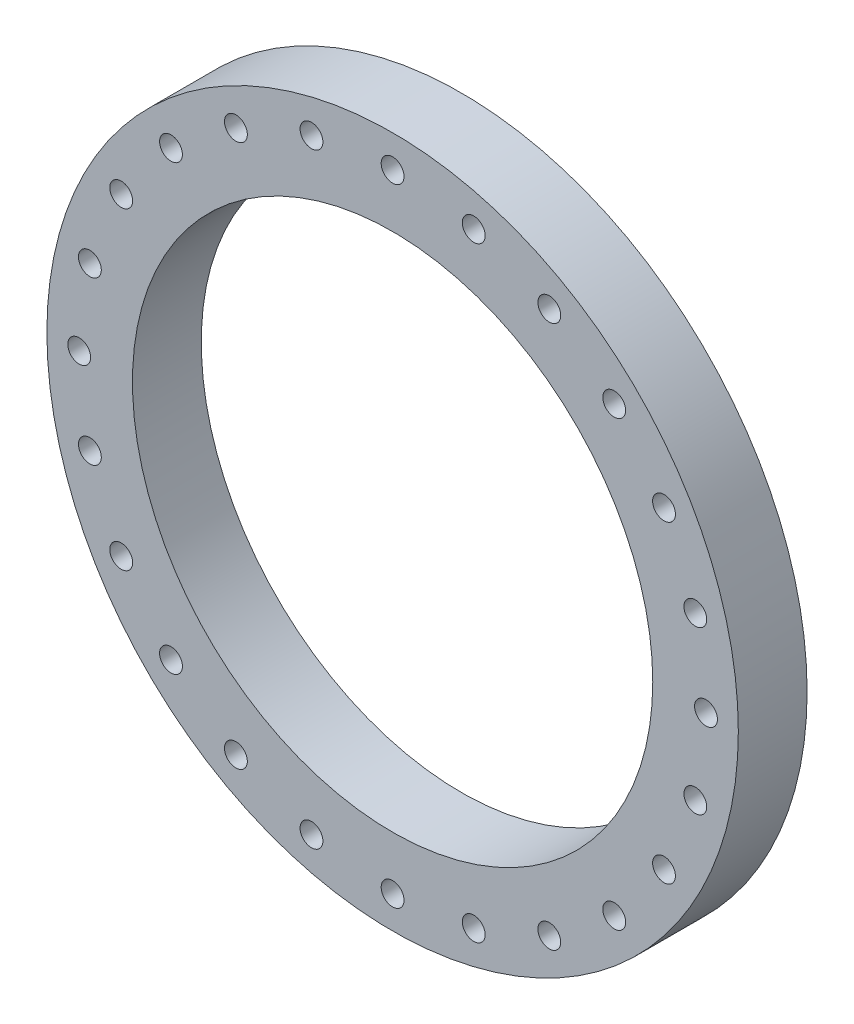
ISO-10303-21;
HEADER;
FILE_DESCRIPTION(('STEP AP214'),'2;1');
FILE_NAME('part.step','',(''),(''),'','','');
FILE_SCHEMA(('AUTOMOTIVE_DESIGN { 1 0 10303 214 1 1 1 1 }'));
ENDSEC;
DATA;
#1=APPLICATION_CONTEXT('core data for automotive mechanical design processes');
#2=APPLICATION_PROTOCOL_DEFINITION('international standard','automotive_design',2000,#1);
#3=PRODUCT_CONTEXT('',#1,'mechanical');
#4=PRODUCT('Part','Part','',(#3));
#5=PRODUCT_RELATED_PRODUCT_CATEGORY('part','',(#4));
#6=PRODUCT_DEFINITION_FORMATION('','',#4);
#7=PRODUCT_DEFINITION_CONTEXT('part definition',#1,'design');
#8=PRODUCT_DEFINITION('design','',#6,#7);
#9=PRODUCT_DEFINITION_SHAPE('','',#8);
#10=(LENGTH_UNIT() NAMED_UNIT(*) SI_UNIT(.MILLI.,.METRE.));
#11=(NAMED_UNIT(*) PLANE_ANGLE_UNIT() SI_UNIT($,.RADIAN.));
#12=(NAMED_UNIT(*) SI_UNIT($,.STERADIAN.) SOLID_ANGLE_UNIT());
#13=UNCERTAINTY_MEASURE_WITH_UNIT(LENGTH_MEASURE(1.E-05),#10,'distance_accuracy_value','');
#14=(GEOMETRIC_REPRESENTATION_CONTEXT(3) GLOBAL_UNCERTAINTY_ASSIGNED_CONTEXT((#13)) GLOBAL_UNIT_ASSIGNED_CONTEXT((#10,
#11,#12)) REPRESENTATION_CONTEXT('',''));
#15=CARTESIAN_POINT('',(0.,0.,0.));
#16=DIRECTION('',(0.,0.,1.));
#17=DIRECTION('',(1.,0.,0.));
#18=AXIS2_PLACEMENT_3D('',#15,#16,#17);
#19=CARTESIAN_POINT('',(0.,0.,12.7));
#20=DIRECTION('',(0.,0.,1.));
#21=DIRECTION('',(1.,0.,0.));
#22=AXIS2_PLACEMENT_3D('',#19,#20,#21);
#23=PLANE('',#22);
#24=CARTESIAN_POINT('',(-14.9755805324852,55.8896274200772,12.7));
#25=DIRECTION('',(0.,0.,1.));
#26=DIRECTION('',(1.,0.,0.));
#27=AXIS2_PLACEMENT_3D('',#24,#25,#26);
#28=CIRCLE('',#27,2.10819999999999);
#29=CARTESIAN_POINT('',(-12.8673805324852,55.8896274200772,12.7));
#30=VERTEX_POINT('',#29);
#31=EDGE_CURVE('E198',#30,#30,#28,.T.);
#32=ORIENTED_EDGE('',*,*,#31,.F.);
#33=EDGE_LOOP('',(#32));
#34=FACE_BOUND('',#33,.T.);
#35=CARTESIAN_POINT('',(-28.9305999999994,50.1092690934525,12.7));
#36=DIRECTION('',(0.,0.,1.));
#37=DIRECTION('',(1.,0.,0.));
#38=AXIS2_PLACEMENT_3D('',#35,#36,#37);
#39=CIRCLE('',#38,2.10819999999999);
#40=CARTESIAN_POINT('',(-26.8223999999994,50.1092690934525,12.7));
#41=VERTEX_POINT('',#40);
#42=EDGE_CURVE('E192',#41,#41,#39,.T.);
#43=ORIENTED_EDGE('',*,*,#42,.F.);
#44=EDGE_LOOP('',(#43));
#45=FACE_BOUND('',#44,.T.);
#46=CARTESIAN_POINT('',(-40.9140468875906,40.9140468875916,12.7));
#47=DIRECTION('',(0.,0.,1.));
#48=DIRECTION('',(1.,0.,0.));
#49=AXIS2_PLACEMENT_3D('',#46,#47,#48);
#50=CIRCLE('',#49,2.10819999999998);
#51=CARTESIAN_POINT('',(-38.8058468875906,40.9140468875916,12.7));
#52=VERTEX_POINT('',#51);
#53=EDGE_CURVE('E186',#52,#52,#50,.T.);
#54=ORIENTED_EDGE('',*,*,#53,.F.);
#55=EDGE_LOOP('',(#54));
#56=FACE_BOUND('',#55,.T.);
#57=CARTESIAN_POINT('',(-50.1092690934518,28.9306000000006,12.7));
#58=DIRECTION('',(0.,0.,1.));
#59=DIRECTION('',(1.,0.,0.));
#60=AXIS2_PLACEMENT_3D('',#57,#58,#59);
#61=CIRCLE('',#60,2.10819999999999);
#62=CARTESIAN_POINT('',(-48.0010690934518,28.9306000000006,12.7));
#63=VERTEX_POINT('',#62);
#64=EDGE_CURVE('E180',#63,#63,#61,.T.);
#65=ORIENTED_EDGE('',*,*,#64,.F.);
#66=EDGE_LOOP('',(#65));
#67=FACE_BOUND('',#66,.T.);
#68=CARTESIAN_POINT('',(-55.8896274200769,14.9755805324866,12.7));
#69=DIRECTION('',(0.,0.,1.));
#70=DIRECTION('',(1.,0.,0.));
#71=AXIS2_PLACEMENT_3D('',#68,#69,#70);
#72=CIRCLE('',#71,2.10819999999999);
#73=CARTESIAN_POINT('',(-53.7814274200769,14.9755805324866,12.7));
#74=VERTEX_POINT('',#73);
#75=EDGE_CURVE('E174',#74,#74,#72,.T.);
#76=ORIENTED_EDGE('',*,*,#75,.F.);
#77=EDGE_LOOP('',(#76));
#78=FACE_BOUND('',#77,.T.);
#79=CARTESIAN_POINT('',(-57.8612,6.06064251161466E-13,12.7));
#80=DIRECTION('',(0.,0.,1.));
#81=DIRECTION('',(1.,0.,0.));
#82=AXIS2_PLACEMENT_3D('',#79,#80,#81);
#83=CIRCLE('',#82,2.10819999999999);
#84=CARTESIAN_POINT('',(-55.753,6.06064251161466E-13,12.7));
#85=VERTEX_POINT('',#84);
#86=EDGE_CURVE('E168',#85,#85,#83,.T.);
#87=ORIENTED_EDGE('',*,*,#86,.F.);
#88=EDGE_LOOP('',(#87));
#89=FACE_BOUND('',#88,.T.);
#90=CARTESIAN_POINT('',(-55.8896274200772,-14.9755805324854,12.7));
#91=DIRECTION('',(0.,0.,1.));
#92=DIRECTION('',(1.,0.,0.));
#93=AXIS2_PLACEMENT_3D('',#90,#91,#92);
#94=CIRCLE('',#93,2.10819999999999);
#95=CARTESIAN_POINT('',(-53.7814274200772,-14.9755805324854,12.7));
#96=VERTEX_POINT('',#95);
#97=EDGE_CURVE('E162',#96,#96,#94,.T.);
#98=ORIENTED_EDGE('',*,*,#97,.F.);
#99=EDGE_LOOP('',(#98));
#100=FACE_BOUND('',#99,.T.);
#101=CARTESIAN_POINT('',(-50.1092690934524,-28.9305999999995,12.7));
#102=DIRECTION('',(0.,0.,1.));
#103=DIRECTION('',(1.,0.,0.));
#104=AXIS2_PLACEMENT_3D('',#101,#102,#103);
#105=CIRCLE('',#104,2.10819999999998);
#106=CARTESIAN_POINT('',(-48.0010690934524,-28.9305999999995,12.7));
#107=VERTEX_POINT('',#106);
#108=EDGE_CURVE('E156',#107,#107,#105,.T.);
#109=ORIENTED_EDGE('',*,*,#108,.F.);
#110=EDGE_LOOP('',(#109));
#111=FACE_BOUND('',#110,.T.);
#112=CARTESIAN_POINT('',(-40.9140468875914,-40.9140468875907,12.7));
#113=DIRECTION('',(0.,0.,1.));
#114=DIRECTION('',(1.,0.,0.));
#115=AXIS2_PLACEMENT_3D('',#112,#113,#114);
#116=CIRCLE('',#115,2.10819999999999);
#117=CARTESIAN_POINT('',(-38.8058468875914,-40.9140468875907,12.7));
#118=VERTEX_POINT('',#117);
#119=EDGE_CURVE('E150',#118,#118,#116,.T.);
#120=ORIENTED_EDGE('',*,*,#119,.F.);
#121=EDGE_LOOP('',(#120));
#122=FACE_BOUND('',#121,.T.);
#123=CARTESIAN_POINT('',(-28.9306000000004,-50.1092690934519,12.7));
#124=DIRECTION('',(0.,0.,1.));
#125=DIRECTION('',(1.,0.,0.));
#126=AXIS2_PLACEMENT_3D('',#123,#124,#125);
#127=CIRCLE('',#126,2.10819999999999);
#128=CARTESIAN_POINT('',(-26.8224000000004,-50.1092690934519,12.7));
#129=VERTEX_POINT('',#128);
#130=EDGE_CURVE('E144',#129,#129,#127,.T.);
#131=ORIENTED_EDGE('',*,*,#130,.F.);
#132=EDGE_LOOP('',(#131));
#133=FACE_BOUND('',#132,.T.);
#134=CARTESIAN_POINT('',(-14.9755805324864,-55.8896274200769,12.7));
#135=DIRECTION('',(0.,0.,1.));
#136=DIRECTION('',(1.,0.,0.));
#137=AXIS2_PLACEMENT_3D('',#134,#135,#136);
#138=CIRCLE('',#137,2.10819999999999);
#139=CARTESIAN_POINT('',(-12.8673805324864,-55.8896274200769,12.7));
#140=VERTEX_POINT('',#139);
#141=EDGE_CURVE('E138',#140,#140,#138,.T.);
#142=ORIENTED_EDGE('',*,*,#141,.F.);
#143=EDGE_LOOP('',(#142));
#144=FACE_BOUND('',#143,.T.);
#145=CARTESIAN_POINT('',(-4.04042834107644E-13,-57.8612,12.7));
#146=DIRECTION('',(0.,0.,1.));
#147=DIRECTION('',(1.,0.,0.));
#148=AXIS2_PLACEMENT_3D('',#145,#146,#147);
#149=CIRCLE('',#148,2.10819999999999);
#150=CARTESIAN_POINT('',(2.10819999999958,-57.8612,12.7));
#151=VERTEX_POINT('',#150);
#152=EDGE_CURVE('E132',#151,#151,#149,.T.);
#153=ORIENTED_EDGE('',*,*,#152,.F.);
#154=EDGE_LOOP('',(#153));
#155=FACE_BOUND('',#154,.T.);
#156=CARTESIAN_POINT('',(14.9755805324856,-55.8896274200771,12.7));
#157=DIRECTION('',(0.,0.,1.));
#158=DIRECTION('',(1.,0.,0.));
#159=AXIS2_PLACEMENT_3D('',#156,#157,#158);
#160=CIRCLE('',#159,2.10819999999999);
#161=CARTESIAN_POINT('',(17.0837805324856,-55.8896274200771,12.7));
#162=VERTEX_POINT('',#161);
#163=EDGE_CURVE('E126',#162,#162,#160,.T.);
#164=ORIENTED_EDGE('',*,*,#163,.F.);
#165=EDGE_LOOP('',(#164));
#166=FACE_BOUND('',#165,.T.);
#167=CARTESIAN_POINT('',(28.9305999999997,-50.1092690934523,12.7));
#168=DIRECTION('',(0.,0.,1.));
#169=DIRECTION('',(1.,0.,0.));
#170=AXIS2_PLACEMENT_3D('',#167,#168,#169);
#171=CIRCLE('',#170,2.10819999999999);
#172=CARTESIAN_POINT('',(31.0387999999997,-50.1092690934523,12.7));
#173=VERTEX_POINT('',#172);
#174=EDGE_CURVE('E120',#173,#173,#171,.T.);
#175=ORIENTED_EDGE('',*,*,#174,.F.);
#176=EDGE_LOOP('',(#175));
#177=FACE_BOUND('',#176,.T.);
#178=CARTESIAN_POINT('',(40.9140468875908,-40.9140468875913,12.7));
#179=DIRECTION('',(0.,0.,1.));
#180=DIRECTION('',(1.,0.,0.));
#181=AXIS2_PLACEMENT_3D('',#178,#179,#180);
#182=CIRCLE('',#181,2.10819999999998);
#183=CARTESIAN_POINT('',(43.0222468875908,-40.9140468875913,12.7));
#184=VERTEX_POINT('',#183);
#185=EDGE_CURVE('E114',#184,#184,#182,.T.);
#186=ORIENTED_EDGE('',*,*,#185,.F.);
#187=EDGE_LOOP('',(#186));
#188=FACE_BOUND('',#187,.T.);
#189=CARTESIAN_POINT('',(50.109269093452,-28.9306000000002,12.7));
#190=DIRECTION('',(0.,0.,1.));
#191=DIRECTION('',(1.,0.,0.));
#192=AXIS2_PLACEMENT_3D('',#189,#190,#191);
#193=CIRCLE('',#192,2.10819999999998);
#194=CARTESIAN_POINT('',(52.217469093452,-28.9306000000002,12.7));
#195=VERTEX_POINT('',#194);
#196=EDGE_CURVE('E108',#195,#195,#193,.T.);
#197=ORIENTED_EDGE('',*,*,#196,.F.);
#198=EDGE_LOOP('',(#197));
#199=FACE_BOUND('',#198,.T.);
#200=CARTESIAN_POINT('',(55.889627420077,-14.9755805324862,12.7));
#201=DIRECTION('',(0.,0.,1.));
#202=DIRECTION('',(1.,0.,0.));
#203=AXIS2_PLACEMENT_3D('',#200,#201,#202);
#204=CIRCLE('',#203,2.10819999999998);
#205=CARTESIAN_POINT('',(57.997827420077,-14.9755805324862,12.7));
#206=VERTEX_POINT('',#205);
#207=EDGE_CURVE('E102',#206,#206,#204,.T.);
#208=ORIENTED_EDGE('',*,*,#207,.F.);
#209=EDGE_LOOP('',(#208));
#210=FACE_BOUND('',#209,.T.);
#211=CARTESIAN_POINT('',(57.8612,-2.02021417053822E-13,12.7));
#212=DIRECTION('',(0.,0.,1.));
#213=DIRECTION('',(1.,0.,0.));
#214=AXIS2_PLACEMENT_3D('',#211,#212,#213);
#215=CIRCLE('',#214,2.10819999999999);
#216=CARTESIAN_POINT('',(59.9694,-2.02021417053822E-13,12.7));
#217=VERTEX_POINT('',#216);
#218=EDGE_CURVE('E96',#217,#217,#215,.T.);
#219=ORIENTED_EDGE('',*,*,#218,.F.);
#220=EDGE_LOOP('',(#219));
#221=FACE_BOUND('',#220,.T.);
#222=CARTESIAN_POINT('',(55.8896274200771,14.9755805324858,12.7));
#223=DIRECTION('',(0.,0.,1.));
#224=DIRECTION('',(1.,0.,0.));
#225=AXIS2_PLACEMENT_3D('',#222,#223,#224);
#226=CIRCLE('',#225,2.10819999999998);
#227=CARTESIAN_POINT('',(57.9978274200771,14.9755805324858,12.7));
#228=VERTEX_POINT('',#227);
#229=EDGE_CURVE('E90',#228,#228,#226,.T.);
#230=ORIENTED_EDGE('',*,*,#229,.F.);
#231=EDGE_LOOP('',(#230));
#232=FACE_BOUND('',#231,.T.);
#233=CARTESIAN_POINT('',(50.1092690934522,28.9305999999999,12.7));
#234=DIRECTION('',(0.,0.,1.));
#235=DIRECTION('',(1.,0.,0.));
#236=AXIS2_PLACEMENT_3D('',#233,#234,#235);
#237=CIRCLE('',#236,2.10819999999999);
#238=CARTESIAN_POINT('',(52.2174690934522,28.9305999999999,12.7));
#239=VERTEX_POINT('',#238);
#240=EDGE_CURVE('E84',#239,#239,#237,.T.);
#241=ORIENTED_EDGE('',*,*,#240,.F.);
#242=EDGE_LOOP('',(#241));
#243=FACE_BOUND('',#242,.T.);
#244=CARTESIAN_POINT('',(40.9140468875911,40.914046887591,12.7));
#245=DIRECTION('',(0.,0.,1.));
#246=DIRECTION('',(1.,0.,0.));
#247=AXIS2_PLACEMENT_3D('',#244,#245,#246);
#248=CIRCLE('',#247,2.10819999999998);
#249=CARTESIAN_POINT('',(43.0222468875911,40.914046887591,12.7));
#250=VERTEX_POINT('',#249);
#251=EDGE_CURVE('E78',#250,#250,#248,.T.);
#252=ORIENTED_EDGE('',*,*,#251,.F.);
#253=EDGE_LOOP('',(#252));
#254=FACE_BOUND('',#253,.T.);
#255=CARTESIAN_POINT('',(28.9306000000001,50.1092690934521,12.7));
#256=DIRECTION('',(0.,0.,1.));
#257=DIRECTION('',(1.,0.,0.));
#258=AXIS2_PLACEMENT_3D('',#255,#256,#257);
#259=CIRCLE('',#258,2.10819999999999);
#260=CARTESIAN_POINT('',(31.0388,50.1092690934521,12.7));
#261=VERTEX_POINT('',#260);
#262=EDGE_CURVE('E72',#261,#261,#259,.T.);
#263=ORIENTED_EDGE('',*,*,#262,.F.);
#264=EDGE_LOOP('',(#263));
#265=FACE_BOUND('',#264,.T.);
#266=CARTESIAN_POINT('',(14.975580532486,55.889627420077,12.7));
#267=DIRECTION('',(0.,0.,1.));
#268=DIRECTION('',(1.,0.,0.));
#269=AXIS2_PLACEMENT_3D('',#266,#267,#268);
#270=CIRCLE('',#269,2.10819999999999);
#271=CARTESIAN_POINT('',(17.083780532486,55.889627420077,12.7));
#272=VERTEX_POINT('',#271);
#273=EDGE_CURVE('E66',#272,#272,#270,.T.);
#274=ORIENTED_EDGE('',*,*,#273,.F.);
#275=EDGE_LOOP('',(#274));
#276=FACE_BOUND('',#275,.T.);
#277=CARTESIAN_POINT('',(0.,57.8612,12.7));
#278=DIRECTION('',(0.,0.,1.));
#279=DIRECTION('',(1.,0.,0.));
#280=AXIS2_PLACEMENT_3D('',#277,#278,#279);
#281=CIRCLE('',#280,2.10819999999999);
#282=CARTESIAN_POINT('',(2.10819999999999,57.8612,12.7));
#283=VERTEX_POINT('',#282);
#284=EDGE_CURVE('E60',#283,#283,#281,.T.);
#285=ORIENTED_EDGE('',*,*,#284,.F.);
#286=EDGE_LOOP('',(#285));
#287=FACE_BOUND('',#286,.T.);
#288=CARTESIAN_POINT('',(0.,0.,12.7));
#289=DIRECTION('',(0.,0.,1.));
#290=DIRECTION('',(1.,0.,0.));
#291=AXIS2_PLACEMENT_3D('',#288,#289,#290);
#292=CIRCLE('',#291,63.8302);
#293=CARTESIAN_POINT('',(63.8302,0.,12.7));
#294=VERTEX_POINT('',#293);
#295=EDGE_CURVE('E10',#294,#294,#292,.T.);
#296=ORIENTED_EDGE('',*,*,#295,.T.);
#297=EDGE_LOOP('',(#296));
#298=FACE_BOUND('',#297,.T.);
#299=CARTESIAN_POINT('',(0.,0.,12.7));
#300=DIRECTION('',(0.,0.,1.));
#301=DIRECTION('',(1.,0.,0.));
#302=AXIS2_PLACEMENT_3D('',#299,#300,#301);
#303=CIRCLE('',#302,48.0314);
#304=CARTESIAN_POINT('',(48.0314,0.,12.7));
#305=VERTEX_POINT('',#304);
#306=EDGE_CURVE('E50',#305,#305,#303,.T.);
#307=ORIENTED_EDGE('',*,*,#306,.F.);
#308=EDGE_LOOP('',(#307));
#309=FACE_BOUND('',#308,.T.);
#310=ADVANCED_FACE('F39',(#34,#45,#56,#67,#78,#89,#100,#111,#122,#133,#144,#155,#166,#177,#188,
#199,#210,#221,#232,#243,#254,#265,#276,#287,#298,#309),#23,.T.);
#311=CARTESIAN_POINT('',(0.,0.,0.));
#312=DIRECTION('',(0.,0.,1.));
#313=DIRECTION('',(1.,0.,0.));
#314=AXIS2_PLACEMENT_3D('',#311,#312,#313);
#315=PLANE('',#314);
#316=CARTESIAN_POINT('',(-14.9755805324852,55.8896274200772,0.));
#317=DIRECTION('',(0.,0.,1.));
#318=DIRECTION('',(1.,0.,0.));
#319=AXIS2_PLACEMENT_3D('',#316,#317,#318);
#320=CIRCLE('',#319,2.10819999999999);
#321=CARTESIAN_POINT('',(-12.8673805324852,55.8896274200772,0.));
#322=VERTEX_POINT('',#321);
#323=EDGE_CURVE('E195',#322,#322,#320,.T.);
#324=ORIENTED_EDGE('',*,*,#323,.T.);
#325=EDGE_LOOP('',(#324));
#326=FACE_BOUND('',#325,.T.);
#327=CARTESIAN_POINT('',(-28.9305999999994,50.1092690934525,0.));
#328=DIRECTION('',(0.,0.,1.));
#329=DIRECTION('',(1.,0.,0.));
#330=AXIS2_PLACEMENT_3D('',#327,#328,#329);
#331=CIRCLE('',#330,2.10819999999999);
#332=CARTESIAN_POINT('',(-26.8223999999994,50.1092690934525,0.));
#333=VERTEX_POINT('',#332);
#334=EDGE_CURVE('E189',#333,#333,#331,.T.);
#335=ORIENTED_EDGE('',*,*,#334,.T.);
#336=EDGE_LOOP('',(#335));
#337=FACE_BOUND('',#336,.T.);
#338=CARTESIAN_POINT('',(-40.9140468875906,40.9140468875916,0.));
#339=DIRECTION('',(0.,0.,1.));
#340=DIRECTION('',(1.,0.,0.));
#341=AXIS2_PLACEMENT_3D('',#338,#339,#340);
#342=CIRCLE('',#341,2.10819999999998);
#343=CARTESIAN_POINT('',(-38.8058468875906,40.9140468875916,0.));
#344=VERTEX_POINT('',#343);
#345=EDGE_CURVE('E183',#344,#344,#342,.T.);
#346=ORIENTED_EDGE('',*,*,#345,.T.);
#347=EDGE_LOOP('',(#346));
#348=FACE_BOUND('',#347,.T.);
#349=CARTESIAN_POINT('',(-50.1092690934518,28.9306000000006,0.));
#350=DIRECTION('',(0.,0.,1.));
#351=DIRECTION('',(1.,0.,0.));
#352=AXIS2_PLACEMENT_3D('',#349,#350,#351);
#353=CIRCLE('',#352,2.10819999999998);
#354=CARTESIAN_POINT('',(-48.0010690934518,28.9306000000006,0.));
#355=VERTEX_POINT('',#354);
#356=EDGE_CURVE('E177',#355,#355,#353,.T.);
#357=ORIENTED_EDGE('',*,*,#356,.T.);
#358=EDGE_LOOP('',(#357));
#359=FACE_BOUND('',#358,.T.);
#360=CARTESIAN_POINT('',(-55.8896274200769,14.9755805324866,0.));
#361=DIRECTION('',(0.,0.,1.));
#362=DIRECTION('',(1.,0.,0.));
#363=AXIS2_PLACEMENT_3D('',#360,#361,#362);
#364=CIRCLE('',#363,2.10819999999998);
#365=CARTESIAN_POINT('',(-53.7814274200769,14.9755805324866,0.));
#366=VERTEX_POINT('',#365);
#367=EDGE_CURVE('E171',#366,#366,#364,.T.);
#368=ORIENTED_EDGE('',*,*,#367,.T.);
#369=EDGE_LOOP('',(#368));
#370=FACE_BOUND('',#369,.T.);
#371=CARTESIAN_POINT('',(-57.8612,6.06064251161466E-13,0.));
#372=DIRECTION('',(0.,0.,1.));
#373=DIRECTION('',(1.,0.,0.));
#374=AXIS2_PLACEMENT_3D('',#371,#372,#373);
#375=CIRCLE('',#374,2.10819999999998);
#376=CARTESIAN_POINT('',(-55.753,6.06064251161466E-13,0.));
#377=VERTEX_POINT('',#376);
#378=EDGE_CURVE('E165',#377,#377,#375,.T.);
#379=ORIENTED_EDGE('',*,*,#378,.T.);
#380=EDGE_LOOP('',(#379));
#381=FACE_BOUND('',#380,.T.);
#382=CARTESIAN_POINT('',(-55.8896274200772,-14.9755805324854,0.));
#383=DIRECTION('',(0.,0.,1.));
#384=DIRECTION('',(1.,0.,0.));
#385=AXIS2_PLACEMENT_3D('',#382,#383,#384);
#386=CIRCLE('',#385,2.10819999999998);
#387=CARTESIAN_POINT('',(-53.7814274200772,-14.9755805324854,0.));
#388=VERTEX_POINT('',#387);
#389=EDGE_CURVE('E159',#388,#388,#386,.T.);
#390=ORIENTED_EDGE('',*,*,#389,.T.);
#391=EDGE_LOOP('',(#390));
#392=FACE_BOUND('',#391,.T.);
#393=CARTESIAN_POINT('',(-50.1092690934524,-28.9305999999995,0.));
#394=DIRECTION('',(0.,0.,1.));
#395=DIRECTION('',(1.,0.,0.));
#396=AXIS2_PLACEMENT_3D('',#393,#394,#395);
#397=CIRCLE('',#396,2.10819999999998);
#398=CARTESIAN_POINT('',(-48.0010690934524,-28.9305999999995,0.));
#399=VERTEX_POINT('',#398);
#400=EDGE_CURVE('E153',#399,#399,#397,.T.);
#401=ORIENTED_EDGE('',*,*,#400,.T.);
#402=EDGE_LOOP('',(#401));
#403=FACE_BOUND('',#402,.T.);
#404=CARTESIAN_POINT('',(-40.9140468875914,-40.9140468875907,0.));
#405=DIRECTION('',(0.,0.,1.));
#406=DIRECTION('',(1.,0.,0.));
#407=AXIS2_PLACEMENT_3D('',#404,#405,#406);
#408=CIRCLE('',#407,2.10819999999998);
#409=CARTESIAN_POINT('',(-38.8058468875914,-40.9140468875907,0.));
#410=VERTEX_POINT('',#409);
#411=EDGE_CURVE('E147',#410,#410,#408,.T.);
#412=ORIENTED_EDGE('',*,*,#411,.T.);
#413=EDGE_LOOP('',(#412));
#414=FACE_BOUND('',#413,.T.);
#415=CARTESIAN_POINT('',(-28.9306000000004,-50.1092690934519,0.));
#416=DIRECTION('',(0.,0.,1.));
#417=DIRECTION('',(1.,0.,0.));
#418=AXIS2_PLACEMENT_3D('',#415,#416,#417);
#419=CIRCLE('',#418,2.10819999999999);
#420=CARTESIAN_POINT('',(-26.8224000000004,-50.1092690934519,0.));
#421=VERTEX_POINT('',#420);
#422=EDGE_CURVE('E141',#421,#421,#419,.T.);
#423=ORIENTED_EDGE('',*,*,#422,.T.);
#424=EDGE_LOOP('',(#423));
#425=FACE_BOUND('',#424,.T.);
#426=CARTESIAN_POINT('',(-14.9755805324864,-55.8896274200769,0.));
#427=DIRECTION('',(0.,0.,1.));
#428=DIRECTION('',(1.,0.,0.));
#429=AXIS2_PLACEMENT_3D('',#426,#427,#428);
#430=CIRCLE('',#429,2.10819999999999);
#431=CARTESIAN_POINT('',(-12.8673805324864,-55.8896274200769,0.));
#432=VERTEX_POINT('',#431);
#433=EDGE_CURVE('E135',#432,#432,#430,.T.);
#434=ORIENTED_EDGE('',*,*,#433,.T.);
#435=EDGE_LOOP('',(#434));
#436=FACE_BOUND('',#435,.T.);
#437=CARTESIAN_POINT('',(-4.04042834107644E-13,-57.8612,0.));
#438=DIRECTION('',(0.,0.,1.));
#439=DIRECTION('',(1.,0.,0.));
#440=AXIS2_PLACEMENT_3D('',#437,#438,#439);
#441=CIRCLE('',#440,2.10819999999999);
#442=CARTESIAN_POINT('',(2.10819999999958,-57.8612,0.));
#443=VERTEX_POINT('',#442);
#444=EDGE_CURVE('E129',#443,#443,#441,.T.);
#445=ORIENTED_EDGE('',*,*,#444,.T.);
#446=EDGE_LOOP('',(#445));
#447=FACE_BOUND('',#446,.T.);
#448=CARTESIAN_POINT('',(14.9755805324856,-55.8896274200771,0.));
#449=DIRECTION('',(0.,0.,1.));
#450=DIRECTION('',(1.,0.,0.));
#451=AXIS2_PLACEMENT_3D('',#448,#449,#450);
#452=CIRCLE('',#451,2.10819999999999);
#453=CARTESIAN_POINT('',(17.0837805324856,-55.8896274200771,0.));
#454=VERTEX_POINT('',#453);
#455=EDGE_CURVE('E123',#454,#454,#452,.T.);
#456=ORIENTED_EDGE('',*,*,#455,.T.);
#457=EDGE_LOOP('',(#456));
#458=FACE_BOUND('',#457,.T.);
#459=CARTESIAN_POINT('',(28.9305999999997,-50.1092690934523,0.));
#460=DIRECTION('',(0.,0.,1.));
#461=DIRECTION('',(1.,0.,0.));
#462=AXIS2_PLACEMENT_3D('',#459,#460,#461);
#463=CIRCLE('',#462,2.10819999999999);
#464=CARTESIAN_POINT('',(31.0387999999997,-50.1092690934523,0.));
#465=VERTEX_POINT('',#464);
#466=EDGE_CURVE('E117',#465,#465,#463,.T.);
#467=ORIENTED_EDGE('',*,*,#466,.T.);
#468=EDGE_LOOP('',(#467));
#469=FACE_BOUND('',#468,.T.);
#470=CARTESIAN_POINT('',(40.9140468875908,-40.9140468875913,0.));
#471=DIRECTION('',(0.,0.,1.));
#472=DIRECTION('',(1.,0.,0.));
#473=AXIS2_PLACEMENT_3D('',#470,#471,#472);
#474=CIRCLE('',#473,2.10819999999998);
#475=CARTESIAN_POINT('',(43.0222468875908,-40.9140468875913,0.));
#476=VERTEX_POINT('',#475);
#477=EDGE_CURVE('E111',#476,#476,#474,.T.);
#478=ORIENTED_EDGE('',*,*,#477,.T.);
#479=EDGE_LOOP('',(#478));
#480=FACE_BOUND('',#479,.T.);
#481=CARTESIAN_POINT('',(50.109269093452,-28.9306000000002,0.));
#482=DIRECTION('',(0.,0.,1.));
#483=DIRECTION('',(1.,0.,0.));
#484=AXIS2_PLACEMENT_3D('',#481,#482,#483);
#485=CIRCLE('',#484,2.10819999999998);
#486=CARTESIAN_POINT('',(52.217469093452,-28.9306000000002,0.));
#487=VERTEX_POINT('',#486);
#488=EDGE_CURVE('E105',#487,#487,#485,.T.);
#489=ORIENTED_EDGE('',*,*,#488,.T.);
#490=EDGE_LOOP('',(#489));
#491=FACE_BOUND('',#490,.T.);
#492=CARTESIAN_POINT('',(55.889627420077,-14.9755805324862,0.));
#493=DIRECTION('',(0.,0.,1.));
#494=DIRECTION('',(1.,0.,0.));
#495=AXIS2_PLACEMENT_3D('',#492,#493,#494);
#496=CIRCLE('',#495,2.10819999999998);
#497=CARTESIAN_POINT('',(57.997827420077,-14.9755805324862,0.));
#498=VERTEX_POINT('',#497);
#499=EDGE_CURVE('E99',#498,#498,#496,.T.);
#500=ORIENTED_EDGE('',*,*,#499,.T.);
#501=EDGE_LOOP('',(#500));
#502=FACE_BOUND('',#501,.T.);
#503=CARTESIAN_POINT('',(57.8612,-2.02021417053822E-13,0.));
#504=DIRECTION('',(0.,0.,1.));
#505=DIRECTION('',(1.,0.,0.));
#506=AXIS2_PLACEMENT_3D('',#503,#504,#505);
#507=CIRCLE('',#506,2.10819999999998);
#508=CARTESIAN_POINT('',(59.9694,-2.02021417053822E-13,0.));
#509=VERTEX_POINT('',#508);
#510=EDGE_CURVE('E93',#509,#509,#507,.T.);
#511=ORIENTED_EDGE('',*,*,#510,.T.);
#512=EDGE_LOOP('',(#511));
#513=FACE_BOUND('',#512,.T.);
#514=CARTESIAN_POINT('',(55.8896274200771,14.9755805324858,0.));
#515=DIRECTION('',(0.,0.,1.));
#516=DIRECTION('',(1.,0.,0.));
#517=AXIS2_PLACEMENT_3D('',#514,#515,#516);
#518=CIRCLE('',#517,2.10819999999998);
#519=CARTESIAN_POINT('',(57.9978274200771,14.9755805324858,0.));
#520=VERTEX_POINT('',#519);
#521=EDGE_CURVE('E87',#520,#520,#518,.T.);
#522=ORIENTED_EDGE('',*,*,#521,.T.);
#523=EDGE_LOOP('',(#522));
#524=FACE_BOUND('',#523,.T.);
#525=CARTESIAN_POINT('',(50.1092690934522,28.9305999999999,0.));
#526=DIRECTION('',(0.,0.,1.));
#527=DIRECTION('',(1.,0.,0.));
#528=AXIS2_PLACEMENT_3D('',#525,#526,#527);
#529=CIRCLE('',#528,2.10819999999998);
#530=CARTESIAN_POINT('',(52.2174690934522,28.9305999999999,0.));
#531=VERTEX_POINT('',#530);
#532=EDGE_CURVE('E81',#531,#531,#529,.T.);
#533=ORIENTED_EDGE('',*,*,#532,.T.);
#534=EDGE_LOOP('',(#533));
#535=FACE_BOUND('',#534,.T.);
#536=CARTESIAN_POINT('',(40.9140468875911,40.914046887591,0.));
#537=DIRECTION('',(0.,0.,1.));
#538=DIRECTION('',(1.,0.,0.));
#539=AXIS2_PLACEMENT_3D('',#536,#537,#538);
#540=CIRCLE('',#539,2.10819999999998);
#541=CARTESIAN_POINT('',(43.0222468875911,40.914046887591,0.));
#542=VERTEX_POINT('',#541);
#543=EDGE_CURVE('E75',#542,#542,#540,.T.);
#544=ORIENTED_EDGE('',*,*,#543,.T.);
#545=EDGE_LOOP('',(#544));
#546=FACE_BOUND('',#545,.T.);
#547=CARTESIAN_POINT('',(28.9306000000001,50.1092690934521,0.));
#548=DIRECTION('',(0.,0.,1.));
#549=DIRECTION('',(1.,0.,0.));
#550=AXIS2_PLACEMENT_3D('',#547,#548,#549);
#551=CIRCLE('',#550,2.10819999999999);
#552=CARTESIAN_POINT('',(31.0388,50.1092690934521,0.));
#553=VERTEX_POINT('',#552);
#554=EDGE_CURVE('E69',#553,#553,#551,.T.);
#555=ORIENTED_EDGE('',*,*,#554,.T.);
#556=EDGE_LOOP('',(#555));
#557=FACE_BOUND('',#556,.T.);
#558=CARTESIAN_POINT('',(14.975580532486,55.889627420077,0.));
#559=DIRECTION('',(0.,0.,1.));
#560=DIRECTION('',(1.,0.,0.));
#561=AXIS2_PLACEMENT_3D('',#558,#559,#560);
#562=CIRCLE('',#561,2.10819999999999);
#563=CARTESIAN_POINT('',(17.083780532486,55.889627420077,0.));
#564=VERTEX_POINT('',#563);
#565=EDGE_CURVE('E63',#564,#564,#562,.T.);
#566=ORIENTED_EDGE('',*,*,#565,.T.);
#567=EDGE_LOOP('',(#566));
#568=FACE_BOUND('',#567,.T.);
#569=CARTESIAN_POINT('',(0.,57.8612,0.));
#570=DIRECTION('',(0.,0.,1.));
#571=DIRECTION('',(1.,0.,0.));
#572=AXIS2_PLACEMENT_3D('',#569,#570,#571);
#573=CIRCLE('',#572,2.10819999999999);
#574=CARTESIAN_POINT('',(2.10819999999999,57.8612,0.));
#575=VERTEX_POINT('',#574);
#576=EDGE_CURVE('E55',#575,#575,#573,.T.);
#577=ORIENTED_EDGE('',*,*,#576,.T.);
#578=EDGE_LOOP('',(#577));
#579=FACE_BOUND('',#578,.T.);
#580=CARTESIAN_POINT('',(0.,0.,0.));
#581=DIRECTION('',(0.,0.,1.));
#582=DIRECTION('',(1.,0.,0.));
#583=AXIS2_PLACEMENT_3D('',#580,#581,#582);
#584=CIRCLE('',#583,63.8302);
#585=CARTESIAN_POINT('',(63.8302,0.,0.));
#586=VERTEX_POINT('',#585);
#587=EDGE_CURVE('E43',#586,#586,#584,.T.);
#588=ORIENTED_EDGE('',*,*,#587,.F.);
#589=EDGE_LOOP('',(#588));
#590=FACE_BOUND('',#589,.T.);
#591=CARTESIAN_POINT('',(0.,0.,0.));
#592=DIRECTION('',(0.,0.,1.));
#593=DIRECTION('',(1.,0.,0.));
#594=AXIS2_PLACEMENT_3D('',#591,#592,#593);
#595=CIRCLE('',#594,48.0314);
#596=CARTESIAN_POINT('',(48.0314,0.,0.));
#597=VERTEX_POINT('',#596);
#598=EDGE_CURVE('E52',#597,#597,#595,.T.);
#599=ORIENTED_EDGE('',*,*,#598,.T.);
#600=EDGE_LOOP('',(#599));
#601=FACE_BOUND('',#600,.T.);
#602=ADVANCED_FACE('F206',(#326,#337,#348,#359,#370,#381,#392,#403,#414,#425,#436,#447,#458,
#469,#480,#491,#502,#513,#524,#535,#546,#557,#568,#579,#590,#601),#315,.F.);
#603=CARTESIAN_POINT('',(0.,0.,12.7));
#604=DIRECTION('',(0.,0.,-1.));
#605=DIRECTION('',(-1.,0.,0.));
#606=AXIS2_PLACEMENT_3D('',#603,#604,#605);
#607=CYLINDRICAL_SURFACE('',#606,63.8302);
#608=ORIENTED_EDGE('',*,*,#295,.F.);
#609=EDGE_LOOP('',(#608));
#610=FACE_BOUND('',#609,.T.);
#611=ORIENTED_EDGE('',*,*,#587,.T.);
#612=EDGE_LOOP('',(#611));
#613=FACE_BOUND('',#612,.T.);
#614=ADVANCED_FACE('F41',(#610,#613),#607,.T.);
#615=CARTESIAN_POINT('',(0.,0.,12.7));
#616=DIRECTION('',(0.,0.,-1.));
#617=DIRECTION('',(-1.,0.,0.));
#618=AXIS2_PLACEMENT_3D('',#615,#616,#617);
#619=CYLINDRICAL_SURFACE('',#618,48.0314);
#620=ORIENTED_EDGE('',*,*,#306,.T.);
#621=EDGE_LOOP('',(#620));
#622=FACE_BOUND('',#621,.T.);
#623=ORIENTED_EDGE('',*,*,#598,.F.);
#624=EDGE_LOOP('',(#623));
#625=FACE_BOUND('',#624,.T.);
#626=ADVANCED_FACE('F256',(#622,#625),#619,.F.);
#627=CARTESIAN_POINT('',(0.,57.8612,12.7));
#628=DIRECTION('',(0.,0.,1.));
#629=DIRECTION('',(1.,0.,0.));
#630=AXIS2_PLACEMENT_3D('',#627,#628,#629);
#631=CYLINDRICAL_SURFACE('',#630,2.10819999999999);
#632=ORIENTED_EDGE('',*,*,#576,.F.);
#633=EDGE_LOOP('',(#632));
#634=FACE_BOUND('',#633,.T.);
#635=ORIENTED_EDGE('',*,*,#284,.T.);
#636=EDGE_LOOP('',(#635));
#637=FACE_BOUND('',#636,.T.);
#638=ADVANCED_FACE('F259',(#634,#637),#631,.F.);
#639=CARTESIAN_POINT('',(14.975580532486,55.889627420077,12.7));
#640=DIRECTION('',(0.,0.,1.));
#641=DIRECTION('',(1.,0.,0.));
#642=AXIS2_PLACEMENT_3D('',#639,#640,#641);
#643=CYLINDRICAL_SURFACE('',#642,2.10819999999999);
#644=ORIENTED_EDGE('',*,*,#565,.F.);
#645=EDGE_LOOP('',(#644));
#646=FACE_BOUND('',#645,.T.);
#647=ORIENTED_EDGE('',*,*,#273,.T.);
#648=EDGE_LOOP('',(#647));
#649=FACE_BOUND('',#648,.T.);
#650=ADVANCED_FACE('F273',(#646,#649),#643,.F.);
#651=CARTESIAN_POINT('',(28.9306000000001,50.1092690934521,12.7));
#652=DIRECTION('',(0.,0.,1.));
#653=DIRECTION('',(1.,0.,0.));
#654=AXIS2_PLACEMENT_3D('',#651,#652,#653);
#655=CYLINDRICAL_SURFACE('',#654,2.10819999999999);
#656=ORIENTED_EDGE('',*,*,#554,.F.);
#657=EDGE_LOOP('',(#656));
#658=FACE_BOUND('',#657,.T.);
#659=ORIENTED_EDGE('',*,*,#262,.T.);
#660=EDGE_LOOP('',(#659));
#661=FACE_BOUND('',#660,.T.);
#662=ADVANCED_FACE('F277',(#658,#661),#655,.F.);
#663=CARTESIAN_POINT('',(40.9140468875911,40.914046887591,12.7));
#664=DIRECTION('',(0.,0.,1.));
#665=DIRECTION('',(1.,0.,0.));
#666=AXIS2_PLACEMENT_3D('',#663,#664,#665);
#667=CYLINDRICAL_SURFACE('',#666,2.10819999999998);
#668=ORIENTED_EDGE('',*,*,#543,.F.);
#669=EDGE_LOOP('',(#668));
#670=FACE_BOUND('',#669,.T.);
#671=ORIENTED_EDGE('',*,*,#251,.T.);
#672=EDGE_LOOP('',(#671));
#673=FACE_BOUND('',#672,.T.);
#674=ADVANCED_FACE('F281',(#670,#673),#667,.F.);
#675=CARTESIAN_POINT('',(50.1092690934522,28.9305999999999,12.7));
#676=DIRECTION('',(0.,0.,1.));
#677=DIRECTION('',(1.,0.,0.));
#678=AXIS2_PLACEMENT_3D('',#675,#676,#677);
#679=CYLINDRICAL_SURFACE('',#678,2.10819999999999);
#680=ORIENTED_EDGE('',*,*,#532,.F.);
#681=EDGE_LOOP('',(#680));
#682=FACE_BOUND('',#681,.T.);
#683=ORIENTED_EDGE('',*,*,#240,.T.);
#684=EDGE_LOOP('',(#683));
#685=FACE_BOUND('',#684,.T.);
#686=ADVANCED_FACE('F285',(#682,#685),#679,.F.);
#687=CARTESIAN_POINT('',(55.8896274200771,14.9755805324858,12.7));
#688=DIRECTION('',(0.,0.,1.));
#689=DIRECTION('',(1.,0.,0.));
#690=AXIS2_PLACEMENT_3D('',#687,#688,#689);
#691=CYLINDRICAL_SURFACE('',#690,2.10819999999998);
#692=ORIENTED_EDGE('',*,*,#521,.F.);
#693=EDGE_LOOP('',(#692));
#694=FACE_BOUND('',#693,.T.);
#695=ORIENTED_EDGE('',*,*,#229,.T.);
#696=EDGE_LOOP('',(#695));
#697=FACE_BOUND('',#696,.T.);
#698=ADVANCED_FACE('F289',(#694,#697),#691,.F.);
#699=CARTESIAN_POINT('',(57.8612,-2.02021417053822E-13,12.7));
#700=DIRECTION('',(0.,0.,1.));
#701=DIRECTION('',(1.,0.,0.));
#702=AXIS2_PLACEMENT_3D('',#699,#700,#701);
#703=CYLINDRICAL_SURFACE('',#702,2.10819999999999);
#704=ORIENTED_EDGE('',*,*,#510,.F.);
#705=EDGE_LOOP('',(#704));
#706=FACE_BOUND('',#705,.T.);
#707=ORIENTED_EDGE('',*,*,#218,.T.);
#708=EDGE_LOOP('',(#707));
#709=FACE_BOUND('',#708,.T.);
#710=ADVANCED_FACE('F293',(#706,#709),#703,.F.);
#711=CARTESIAN_POINT('',(55.889627420077,-14.9755805324862,12.7));
#712=DIRECTION('',(0.,0.,1.));
#713=DIRECTION('',(1.,0.,0.));
#714=AXIS2_PLACEMENT_3D('',#711,#712,#713);
#715=CYLINDRICAL_SURFACE('',#714,2.10819999999998);
#716=ORIENTED_EDGE('',*,*,#499,.F.);
#717=EDGE_LOOP('',(#716));
#718=FACE_BOUND('',#717,.T.);
#719=ORIENTED_EDGE('',*,*,#207,.T.);
#720=EDGE_LOOP('',(#719));
#721=FACE_BOUND('',#720,.T.);
#722=ADVANCED_FACE('F297',(#718,#721),#715,.F.);
#723=CARTESIAN_POINT('',(50.109269093452,-28.9306000000002,12.7));
#724=DIRECTION('',(0.,0.,1.));
#725=DIRECTION('',(1.,0.,0.));
#726=AXIS2_PLACEMENT_3D('',#723,#724,#725);
#727=CYLINDRICAL_SURFACE('',#726,2.10819999999998);
#728=ORIENTED_EDGE('',*,*,#488,.F.);
#729=EDGE_LOOP('',(#728));
#730=FACE_BOUND('',#729,.T.);
#731=ORIENTED_EDGE('',*,*,#196,.T.);
#732=EDGE_LOOP('',(#731));
#733=FACE_BOUND('',#732,.T.);
#734=ADVANCED_FACE('F301',(#730,#733),#727,.F.);
#735=CARTESIAN_POINT('',(40.9140468875908,-40.9140468875913,12.7));
#736=DIRECTION('',(0.,0.,1.));
#737=DIRECTION('',(1.,0.,0.));
#738=AXIS2_PLACEMENT_3D('',#735,#736,#737);
#739=CYLINDRICAL_SURFACE('',#738,2.10819999999998);
#740=ORIENTED_EDGE('',*,*,#477,.F.);
#741=EDGE_LOOP('',(#740));
#742=FACE_BOUND('',#741,.T.);
#743=ORIENTED_EDGE('',*,*,#185,.T.);
#744=EDGE_LOOP('',(#743));
#745=FACE_BOUND('',#744,.T.);
#746=ADVANCED_FACE('F305',(#742,#745),#739,.F.);
#747=CARTESIAN_POINT('',(28.9305999999997,-50.1092690934523,12.7));
#748=DIRECTION('',(0.,0.,1.));
#749=DIRECTION('',(1.,0.,0.));
#750=AXIS2_PLACEMENT_3D('',#747,#748,#749);
#751=CYLINDRICAL_SURFACE('',#750,2.10819999999999);
#752=ORIENTED_EDGE('',*,*,#466,.F.);
#753=EDGE_LOOP('',(#752));
#754=FACE_BOUND('',#753,.T.);
#755=ORIENTED_EDGE('',*,*,#174,.T.);
#756=EDGE_LOOP('',(#755));
#757=FACE_BOUND('',#756,.T.);
#758=ADVANCED_FACE('F309',(#754,#757),#751,.F.);
#759=CARTESIAN_POINT('',(14.9755805324856,-55.8896274200771,12.7));
#760=DIRECTION('',(0.,0.,1.));
#761=DIRECTION('',(1.,0.,0.));
#762=AXIS2_PLACEMENT_3D('',#759,#760,#761);
#763=CYLINDRICAL_SURFACE('',#762,2.10819999999999);
#764=ORIENTED_EDGE('',*,*,#455,.F.);
#765=EDGE_LOOP('',(#764));
#766=FACE_BOUND('',#765,.T.);
#767=ORIENTED_EDGE('',*,*,#163,.T.);
#768=EDGE_LOOP('',(#767));
#769=FACE_BOUND('',#768,.T.);
#770=ADVANCED_FACE('F313',(#766,#769),#763,.F.);
#771=CARTESIAN_POINT('',(-4.04042834107644E-13,-57.8612,12.7));
#772=DIRECTION('',(0.,0.,1.));
#773=DIRECTION('',(1.,0.,0.));
#774=AXIS2_PLACEMENT_3D('',#771,#772,#773);
#775=CYLINDRICAL_SURFACE('',#774,2.10819999999999);
#776=ORIENTED_EDGE('',*,*,#444,.F.);
#777=EDGE_LOOP('',(#776));
#778=FACE_BOUND('',#777,.T.);
#779=ORIENTED_EDGE('',*,*,#152,.T.);
#780=EDGE_LOOP('',(#779));
#781=FACE_BOUND('',#780,.T.);
#782=ADVANCED_FACE('F317',(#778,#781),#775,.F.);
#783=CARTESIAN_POINT('',(-14.9755805324864,-55.8896274200769,12.7));
#784=DIRECTION('',(0.,0.,1.));
#785=DIRECTION('',(1.,0.,0.));
#786=AXIS2_PLACEMENT_3D('',#783,#784,#785);
#787=CYLINDRICAL_SURFACE('',#786,2.10819999999999);
#788=ORIENTED_EDGE('',*,*,#433,.F.);
#789=EDGE_LOOP('',(#788));
#790=FACE_BOUND('',#789,.T.);
#791=ORIENTED_EDGE('',*,*,#141,.T.);
#792=EDGE_LOOP('',(#791));
#793=FACE_BOUND('',#792,.T.);
#794=ADVANCED_FACE('F321',(#790,#793),#787,.F.);
#795=CARTESIAN_POINT('',(-28.9306000000004,-50.1092690934519,12.7));
#796=DIRECTION('',(0.,0.,1.));
#797=DIRECTION('',(1.,0.,0.));
#798=AXIS2_PLACEMENT_3D('',#795,#796,#797);
#799=CYLINDRICAL_SURFACE('',#798,2.10819999999999);
#800=ORIENTED_EDGE('',*,*,#422,.F.);
#801=EDGE_LOOP('',(#800));
#802=FACE_BOUND('',#801,.T.);
#803=ORIENTED_EDGE('',*,*,#130,.T.);
#804=EDGE_LOOP('',(#803));
#805=FACE_BOUND('',#804,.T.);
#806=ADVANCED_FACE('F325',(#802,#805),#799,.F.);
#807=CARTESIAN_POINT('',(-40.9140468875914,-40.9140468875907,12.7));
#808=DIRECTION('',(0.,0.,1.));
#809=DIRECTION('',(1.,0.,0.));
#810=AXIS2_PLACEMENT_3D('',#807,#808,#809);
#811=CYLINDRICAL_SURFACE('',#810,2.10819999999999);
#812=ORIENTED_EDGE('',*,*,#411,.F.);
#813=EDGE_LOOP('',(#812));
#814=FACE_BOUND('',#813,.T.);
#815=ORIENTED_EDGE('',*,*,#119,.T.);
#816=EDGE_LOOP('',(#815));
#817=FACE_BOUND('',#816,.T.);
#818=ADVANCED_FACE('F329',(#814,#817),#811,.F.);
#819=CARTESIAN_POINT('',(-50.1092690934524,-28.9305999999995,12.7));
#820=DIRECTION('',(0.,0.,1.));
#821=DIRECTION('',(1.,0.,0.));
#822=AXIS2_PLACEMENT_3D('',#819,#820,#821);
#823=CYLINDRICAL_SURFACE('',#822,2.10819999999998);
#824=ORIENTED_EDGE('',*,*,#400,.F.);
#825=EDGE_LOOP('',(#824));
#826=FACE_BOUND('',#825,.T.);
#827=ORIENTED_EDGE('',*,*,#108,.T.);
#828=EDGE_LOOP('',(#827));
#829=FACE_BOUND('',#828,.T.);
#830=ADVANCED_FACE('F333',(#826,#829),#823,.F.);
#831=CARTESIAN_POINT('',(-55.8896274200772,-14.9755805324854,12.7));
#832=DIRECTION('',(0.,0.,1.));
#833=DIRECTION('',(1.,0.,0.));
#834=AXIS2_PLACEMENT_3D('',#831,#832,#833);
#835=CYLINDRICAL_SURFACE('',#834,2.10819999999999);
#836=ORIENTED_EDGE('',*,*,#389,.F.);
#837=EDGE_LOOP('',(#836));
#838=FACE_BOUND('',#837,.T.);
#839=ORIENTED_EDGE('',*,*,#97,.T.);
#840=EDGE_LOOP('',(#839));
#841=FACE_BOUND('',#840,.T.);
#842=ADVANCED_FACE('F337',(#838,#841),#835,.F.);
#843=CARTESIAN_POINT('',(-57.8612,6.06064251161466E-13,12.7));
#844=DIRECTION('',(0.,0.,1.));
#845=DIRECTION('',(1.,0.,0.));
#846=AXIS2_PLACEMENT_3D('',#843,#844,#845);
#847=CYLINDRICAL_SURFACE('',#846,2.10819999999999);
#848=ORIENTED_EDGE('',*,*,#378,.F.);
#849=EDGE_LOOP('',(#848));
#850=FACE_BOUND('',#849,.T.);
#851=ORIENTED_EDGE('',*,*,#86,.T.);
#852=EDGE_LOOP('',(#851));
#853=FACE_BOUND('',#852,.T.);
#854=ADVANCED_FACE('F341',(#850,#853),#847,.F.);
#855=CARTESIAN_POINT('',(-55.8896274200769,14.9755805324866,12.7));
#856=DIRECTION('',(0.,0.,1.));
#857=DIRECTION('',(1.,0.,0.));
#858=AXIS2_PLACEMENT_3D('',#855,#856,#857);
#859=CYLINDRICAL_SURFACE('',#858,2.10819999999999);
#860=ORIENTED_EDGE('',*,*,#367,.F.);
#861=EDGE_LOOP('',(#860));
#862=FACE_BOUND('',#861,.T.);
#863=ORIENTED_EDGE('',*,*,#75,.T.);
#864=EDGE_LOOP('',(#863));
#865=FACE_BOUND('',#864,.T.);
#866=ADVANCED_FACE('F345',(#862,#865),#859,.F.);
#867=CARTESIAN_POINT('',(-50.1092690934518,28.9306000000006,12.7));
#868=DIRECTION('',(0.,0.,1.));
#869=DIRECTION('',(1.,0.,0.));
#870=AXIS2_PLACEMENT_3D('',#867,#868,#869);
#871=CYLINDRICAL_SURFACE('',#870,2.10819999999999);
#872=ORIENTED_EDGE('',*,*,#356,.F.);
#873=EDGE_LOOP('',(#872));
#874=FACE_BOUND('',#873,.T.);
#875=ORIENTED_EDGE('',*,*,#64,.T.);
#876=EDGE_LOOP('',(#875));
#877=FACE_BOUND('',#876,.T.);
#878=ADVANCED_FACE('F349',(#874,#877),#871,.F.);
#879=CARTESIAN_POINT('',(-40.9140468875906,40.9140468875916,12.7));
#880=DIRECTION('',(0.,0.,1.));
#881=DIRECTION('',(1.,0.,0.));
#882=AXIS2_PLACEMENT_3D('',#879,#880,#881);
#883=CYLINDRICAL_SURFACE('',#882,2.10819999999998);
#884=ORIENTED_EDGE('',*,*,#345,.F.);
#885=EDGE_LOOP('',(#884));
#886=FACE_BOUND('',#885,.T.);
#887=ORIENTED_EDGE('',*,*,#53,.T.);
#888=EDGE_LOOP('',(#887));
#889=FACE_BOUND('',#888,.T.);
#890=ADVANCED_FACE('F353',(#886,#889),#883,.F.);
#891=CARTESIAN_POINT('',(-28.9305999999994,50.1092690934525,12.7));
#892=DIRECTION('',(0.,0.,1.));
#893=DIRECTION('',(1.,0.,0.));
#894=AXIS2_PLACEMENT_3D('',#891,#892,#893);
#895=CYLINDRICAL_SURFACE('',#894,2.10819999999999);
#896=ORIENTED_EDGE('',*,*,#334,.F.);
#897=EDGE_LOOP('',(#896));
#898=FACE_BOUND('',#897,.T.);
#899=ORIENTED_EDGE('',*,*,#42,.T.);
#900=EDGE_LOOP('',(#899));
#901=FACE_BOUND('',#900,.T.);
#902=ADVANCED_FACE('F357',(#898,#901),#895,.F.);
#903=CARTESIAN_POINT('',(-14.9755805324852,55.8896274200772,12.7));
#904=DIRECTION('',(0.,0.,1.));
#905=DIRECTION('',(1.,0.,0.));
#906=AXIS2_PLACEMENT_3D('',#903,#904,#905);
#907=CYLINDRICAL_SURFACE('',#906,2.10819999999999);
#908=ORIENTED_EDGE('',*,*,#323,.F.);
#909=EDGE_LOOP('',(#908));
#910=FACE_BOUND('',#909,.T.);
#911=ORIENTED_EDGE('',*,*,#31,.T.);
#912=EDGE_LOOP('',(#911));
#913=FACE_BOUND('',#912,.T.);
#914=ADVANCED_FACE('F202',(#910,#913),#907,.F.);
#915=CLOSED_SHELL('',(#310,#602,#614,#626,#638,#650,#662,#674,#686,#698,#710,#722,#734,#746,
#758,#770,#782,#794,#806,#818,#830,#842,#854,#866,#878,#890,#902,#914));
#916=MANIFOLD_SOLID_BREP('B2',#915);
#917=ADVANCED_BREP_SHAPE_REPRESENTATION('',(#18,#916),#14);
#918=SHAPE_DEFINITION_REPRESENTATION(#9,#917);
ENDSEC;
END-ISO-10303-21;
